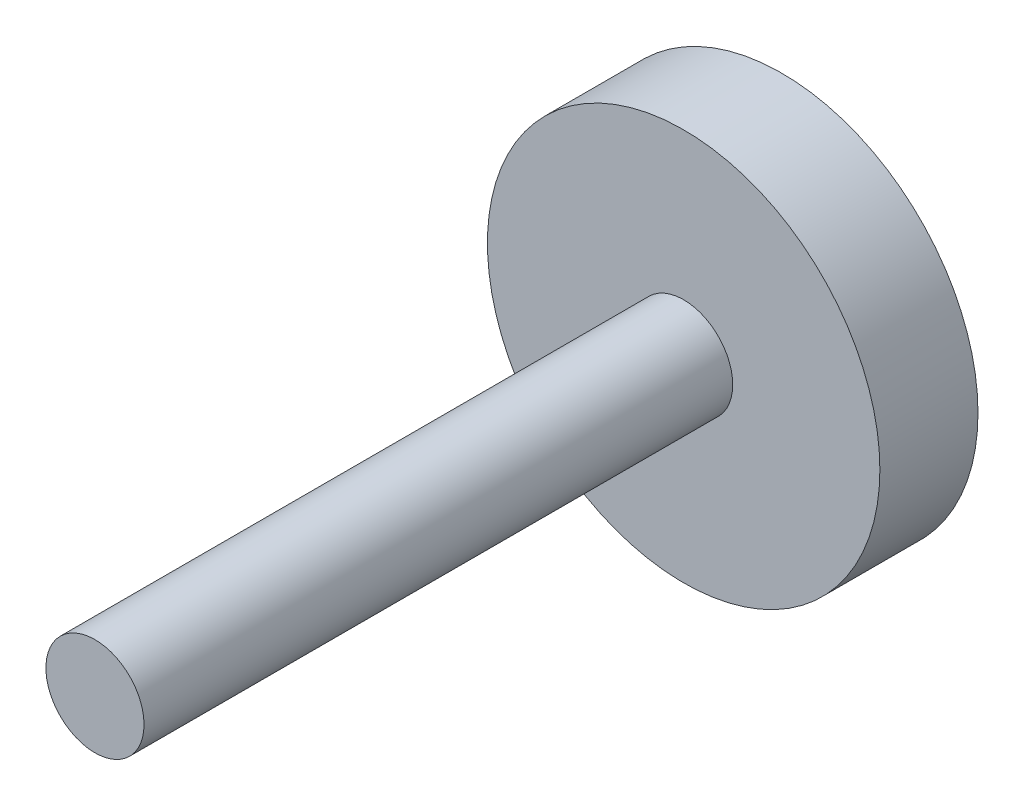
ISO-10303-21;
HEADER;
FILE_DESCRIPTION(('STEP AP214'),'2;1');
FILE_NAME('part.step','',(''),(''),'','','');
FILE_SCHEMA(('AUTOMOTIVE_DESIGN { 1 0 10303 214 1 1 1 1 }'));
ENDSEC;
DATA;
#1=APPLICATION_CONTEXT('core data for automotive mechanical design processes');
#2=APPLICATION_PROTOCOL_DEFINITION('international standard','automotive_design',2000,#1);
#3=PRODUCT_CONTEXT('',#1,'mechanical');
#4=PRODUCT('Part','Part','',(#3));
#5=PRODUCT_RELATED_PRODUCT_CATEGORY('part','',(#4));
#6=PRODUCT_DEFINITION_FORMATION('','',#4);
#7=PRODUCT_DEFINITION_CONTEXT('part definition',#1,'design');
#8=PRODUCT_DEFINITION('design','',#6,#7);
#9=PRODUCT_DEFINITION_SHAPE('','',#8);
#10=(LENGTH_UNIT() NAMED_UNIT(*) SI_UNIT(.MILLI.,.METRE.));
#11=(NAMED_UNIT(*) PLANE_ANGLE_UNIT() SI_UNIT($,.RADIAN.));
#12=(NAMED_UNIT(*) SI_UNIT($,.STERADIAN.) SOLID_ANGLE_UNIT());
#13=UNCERTAINTY_MEASURE_WITH_UNIT(LENGTH_MEASURE(1.E-05),#10,'distance_accuracy_value','');
#14=(GEOMETRIC_REPRESENTATION_CONTEXT(3) GLOBAL_UNCERTAINTY_ASSIGNED_CONTEXT((#13)) GLOBAL_UNIT_ASSIGNED_CONTEXT((#10,
#11,#12)) REPRESENTATION_CONTEXT('',''));
#15=CARTESIAN_POINT('',(0.,0.,0.));
#16=DIRECTION('',(0.,0.,1.));
#17=DIRECTION('',(1.,0.,0.));
#18=AXIS2_PLACEMENT_3D('',#15,#16,#17);
#19=CARTESIAN_POINT('',(0.,0.,1.25));
#20=DIRECTION('',(0.,0.,-1.));
#21=DIRECTION('',(-1.,0.,0.));
#22=AXIS2_PLACEMENT_3D('',#19,#20,#21);
#23=CYLINDRICAL_SURFACE('',#22,5.);
#24=CARTESIAN_POINT('',(0.,0.,1.25));
#25=DIRECTION('',(0.,0.,1.));
#26=DIRECTION('',(1.,0.,0.));
#27=AXIS2_PLACEMENT_3D('',#24,#25,#26);
#28=CIRCLE('',#27,5.);
#29=CARTESIAN_POINT('',(5.,0.,1.25));
#30=VERTEX_POINT('',#29);
#31=EDGE_CURVE('E45',#30,#30,#28,.T.);
#32=ORIENTED_EDGE('',*,*,#31,.F.);
#33=EDGE_LOOP('',(#32));
#34=FACE_BOUND('',#33,.T.);
#35=CARTESIAN_POINT('',(0.,0.,-1.25));
#36=DIRECTION('',(0.,0.,1.));
#37=DIRECTION('',(1.,0.,0.));
#38=AXIS2_PLACEMENT_3D('',#35,#36,#37);
#39=CIRCLE('',#38,5.);
#40=CARTESIAN_POINT('',(5.,0.,-1.25));
#41=VERTEX_POINT('',#40);
#42=EDGE_CURVE('E40',#41,#41,#39,.T.);
#43=ORIENTED_EDGE('',*,*,#42,.T.);
#44=EDGE_LOOP('',(#43));
#45=FACE_BOUND('',#44,.T.);
#46=ADVANCED_FACE('F37',(#34,#45),#23,.T.);
#47=CARTESIAN_POINT('',(0.,0.,1.25));
#48=DIRECTION('',(0.,0.,1.));
#49=DIRECTION('',(1.,0.,0.));
#50=AXIS2_PLACEMENT_3D('',#47,#48,#49);
#51=PLANE('',#50);
#52=CARTESIAN_POINT('',(0.,0.,1.25));
#53=DIRECTION('',(0.,0.,1.));
#54=DIRECTION('',(1.,0.,0.));
#55=AXIS2_PLACEMENT_3D('',#52,#53,#54);
#56=CIRCLE('',#55,1.25);
#57=CARTESIAN_POINT('',(1.25,0.,1.25));
#58=VERTEX_POINT('',#57);
#59=EDGE_CURVE('E10',#58,#58,#56,.T.);
#60=ORIENTED_EDGE('',*,*,#59,.F.);
#61=EDGE_LOOP('',(#60));
#62=FACE_BOUND('',#61,.T.);
#63=ORIENTED_EDGE('',*,*,#31,.T.);
#64=EDGE_LOOP('',(#63));
#65=FACE_BOUND('',#64,.T.);
#66=ADVANCED_FACE('F65',(#62,#65),#51,.T.);
#67=CARTESIAN_POINT('',(0.,0.,-1.25));
#68=DIRECTION('',(0.,0.,1.));
#69=DIRECTION('',(1.,0.,0.));
#70=AXIS2_PLACEMENT_3D('',#67,#68,#69);
#71=PLANE('',#70);
#72=ORIENTED_EDGE('',*,*,#42,.F.);
#73=EDGE_LOOP('',(#72));
#74=FACE_BOUND('',#73,.T.);
#75=ADVANCED_FACE('F62',(#74),#71,.F.);
#76=CARTESIAN_POINT('',(0.,0.,16.25));
#77=DIRECTION('',(0.,0.,-1.));
#78=DIRECTION('',(-1.,0.,0.));
#79=AXIS2_PLACEMENT_3D('',#76,#77,#78);
#80=CYLINDRICAL_SURFACE('',#79,1.25);
#81=CARTESIAN_POINT('',(0.,0.,16.25));
#82=DIRECTION('',(0.,0.,1.));
#83=DIRECTION('',(1.,0.,0.));
#84=AXIS2_PLACEMENT_3D('',#81,#82,#83);
#85=CIRCLE('',#84,1.25);
#86=CARTESIAN_POINT('',(1.25,0.,16.25));
#87=VERTEX_POINT('',#86);
#88=EDGE_CURVE('E52',#87,#87,#85,.T.);
#89=ORIENTED_EDGE('',*,*,#88,.F.);
#90=EDGE_LOOP('',(#89));
#91=FACE_BOUND('',#90,.T.);
#92=ORIENTED_EDGE('',*,*,#59,.T.);
#93=EDGE_LOOP('',(#92));
#94=FACE_BOUND('',#93,.T.);
#95=ADVANCED_FACE('F64',(#91,#94),#80,.T.);
#96=CARTESIAN_POINT('',(0.,0.,16.25));
#97=DIRECTION('',(0.,0.,1.));
#98=DIRECTION('',(1.,0.,0.));
#99=AXIS2_PLACEMENT_3D('',#96,#97,#98);
#100=PLANE('',#99);
#101=ORIENTED_EDGE('',*,*,#88,.T.);
#102=EDGE_LOOP('',(#101));
#103=FACE_BOUND('',#102,.T.);
#104=ADVANCED_FACE('F70',(#103),#100,.T.);
#105=CLOSED_SHELL('',(#46,#66,#75,#95,#104));
#106=MANIFOLD_SOLID_BREP('B2',#105);
#107=ADVANCED_BREP_SHAPE_REPRESENTATION('',(#18,#106),#14);
#108=SHAPE_DEFINITION_REPRESENTATION(#9,#107);
ENDSEC;
END-ISO-10303-21;
